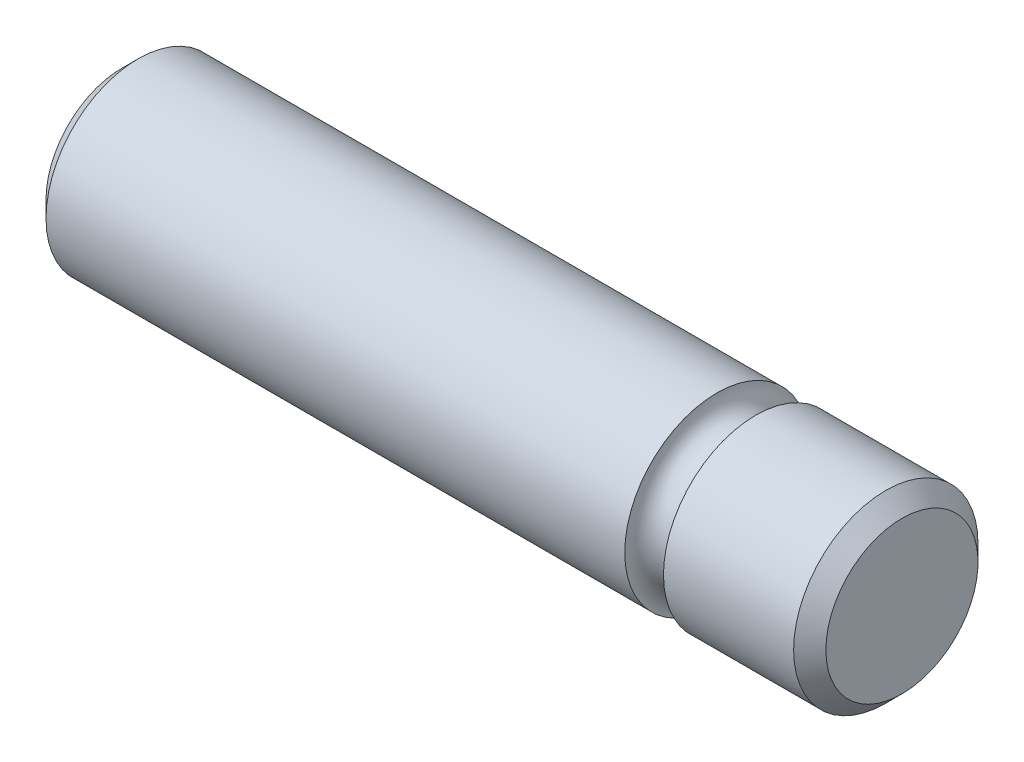
ISO-10303-21;
HEADER;
FILE_DESCRIPTION(('STEP AP214'),'2;1');
FILE_NAME('part.step','',(''),(''),'','','');
FILE_SCHEMA(('AUTOMOTIVE_DESIGN { 1 0 10303 214 1 1 1 1 }'));
ENDSEC;
DATA;
#1=APPLICATION_CONTEXT('core data for automotive mechanical design processes');
#2=APPLICATION_PROTOCOL_DEFINITION('international standard','automotive_design',2000,#1);
#3=PRODUCT_CONTEXT('',#1,'mechanical');
#4=PRODUCT('Part','Part','',(#3));
#5=PRODUCT_RELATED_PRODUCT_CATEGORY('part','',(#4));
#6=PRODUCT_DEFINITION_FORMATION('','',#4);
#7=PRODUCT_DEFINITION_CONTEXT('part definition',#1,'design');
#8=PRODUCT_DEFINITION('design','',#6,#7);
#9=PRODUCT_DEFINITION_SHAPE('','',#8);
#10=(LENGTH_UNIT() NAMED_UNIT(*) SI_UNIT(.MILLI.,.METRE.));
#11=(NAMED_UNIT(*) PLANE_ANGLE_UNIT() SI_UNIT($,.RADIAN.));
#12=(NAMED_UNIT(*) SI_UNIT($,.STERADIAN.) SOLID_ANGLE_UNIT());
#13=UNCERTAINTY_MEASURE_WITH_UNIT(LENGTH_MEASURE(1.E-05),#10,'distance_accuracy_value','');
#14=(GEOMETRIC_REPRESENTATION_CONTEXT(3) GLOBAL_UNCERTAINTY_ASSIGNED_CONTEXT((#13)) GLOBAL_UNIT_ASSIGNED_CONTEXT((#10,
#11,#12)) REPRESENTATION_CONTEXT('',''));
#15=CARTESIAN_POINT('',(0.,0.,0.));
#16=DIRECTION('',(0.,0.,1.));
#17=DIRECTION('',(1.,0.,0.));
#18=AXIS2_PLACEMENT_3D('',#15,#16,#17);
#19=CARTESIAN_POINT('',(5.29592791208791,0.,0.));
#20=DIRECTION('',(-1.,0.,0.));
#21=DIRECTION('',(0.,0.,1.));
#22=AXIS2_PLACEMENT_3D('',#19,#20,#21);
#23=TOROIDAL_SURFACE('',#22,2.17172791208791,0.457227912087912);
#24=CARTESIAN_POINT('',(5.75312791208791,0.,0.));
#25=DIRECTION('',(-1.,0.,0.));
#26=DIRECTION('',(0.,0.,1.));
#27=AXIS2_PLACEMENT_3D('',#24,#25,#26);
#28=CIRCLE('',#27,2.17678);
#29=CARTESIAN_POINT('',(5.75312791208791,0.,2.17678));
#30=VERTEX_POINT('',#29);
#31=EDGE_CURVE('E28',#30,#30,#28,.T.);
#32=ORIENTED_EDGE('',*,*,#31,.T.);
#33=EDGE_LOOP('',(#32));
#34=FACE_BOUND('',#33,.T.);
#35=CARTESIAN_POINT('',(4.83872791208791,0.,0.));
#36=DIRECTION('',(-1.,0.,0.));
#37=DIRECTION('',(0.,0.,1.));
#38=AXIS2_PLACEMENT_3D('',#35,#36,#37);
#39=CIRCLE('',#38,2.17678);
#40=CARTESIAN_POINT('',(4.83872791208791,0.,2.17678));
#41=VERTEX_POINT('',#40);
#42=EDGE_CURVE('E23',#41,#41,#39,.T.);
#43=ORIENTED_EDGE('',*,*,#42,.F.);
#44=EDGE_LOOP('',(#43));
#45=FACE_BOUND('',#44,.T.);
#46=ADVANCED_FACE('F15',(#34,#45),#23,.F.);
#47=CARTESIAN_POINT('',(-8.82650000000001,0.,0.));
#48=DIRECTION('',(1.,0.,0.));
#49=DIRECTION('',(0.,0.,-1.));
#50=AXIS2_PLACEMENT_3D('',#47,#48,#49);
#51=CONICAL_SURFACE('',#50,2.17678,0.785398163397462);
#52=CARTESIAN_POINT('',(-8.82650000000001,0.,0.));
#53=DIRECTION('',(-1.,0.,0.));
#54=DIRECTION('',(0.,0.,1.));
#55=AXIS2_PLACEMENT_3D('',#52,#53,#54);
#56=CIRCLE('',#55,2.17678);
#57=CARTESIAN_POINT('',(-8.82650000000001,0.,2.17678));
#58=VERTEX_POINT('',#57);
#59=EDGE_CURVE('E10',#58,#58,#56,.T.);
#60=ORIENTED_EDGE('',*,*,#59,.T.);
#61=EDGE_LOOP('',(#60));
#62=FACE_BOUND('',#61,.T.);
#63=CARTESIAN_POINT('',(-9.2075,0.,0.));
#64=DIRECTION('',(-1.,0.,0.));
#65=DIRECTION('',(0.,0.,1.));
#66=AXIS2_PLACEMENT_3D('',#63,#64,#65);
#67=CIRCLE('',#66,1.79578);
#68=CARTESIAN_POINT('',(-9.2075,0.,1.79578));
#69=VERTEX_POINT('',#68);
#70=EDGE_CURVE('E32',#69,#69,#67,.T.);
#71=ORIENTED_EDGE('',*,*,#70,.F.);
#72=EDGE_LOOP('',(#71));
#73=FACE_BOUND('',#72,.T.);
#74=ADVANCED_FACE('F45',(#62,#73),#51,.T.);
#75=CARTESIAN_POINT('',(-25.416699322286,0.,0.));
#76=DIRECTION('',(-1.,0.,0.));
#77=DIRECTION('',(0.,0.,1.));
#78=AXIS2_PLACEMENT_3D('',#75,#76,#77);
#79=CYLINDRICAL_SURFACE('',#78,2.17678);
#80=ORIENTED_EDGE('',*,*,#59,.F.);
#81=EDGE_LOOP('',(#80));
#82=FACE_BOUND('',#81,.T.);
#83=ORIENTED_EDGE('',*,*,#42,.T.);
#84=EDGE_LOOP('',(#83));
#85=FACE_BOUND('',#84,.T.);
#86=ADVANCED_FACE('F47',(#82,#85),#79,.T.);
#87=CARTESIAN_POINT('',(-25.416699322286,0.,0.));
#88=DIRECTION('',(-1.,0.,0.));
#89=DIRECTION('',(0.,0.,1.));
#90=AXIS2_PLACEMENT_3D('',#87,#88,#89);
#91=CYLINDRICAL_SURFACE('',#90,2.17678);
#92=ORIENTED_EDGE('',*,*,#31,.F.);
#93=EDGE_LOOP('',(#92));
#94=FACE_BOUND('',#93,.T.);
#95=CARTESIAN_POINT('',(8.82650000000001,0.,0.));
#96=DIRECTION('',(-1.,0.,0.));
#97=DIRECTION('',(0.,0.,1.));
#98=AXIS2_PLACEMENT_3D('',#95,#96,#97);
#99=CIRCLE('',#98,2.17678);
#100=CARTESIAN_POINT('',(8.82650000000001,0.,2.17678));
#101=VERTEX_POINT('',#100);
#102=EDGE_CURVE('E34',#101,#101,#99,.T.);
#103=ORIENTED_EDGE('',*,*,#102,.T.);
#104=EDGE_LOOP('',(#103));
#105=FACE_BOUND('',#104,.T.);
#106=ADVANCED_FACE('F54',(#94,#105),#91,.T.);
#107=CARTESIAN_POINT('',(9.2075,0.,0.));
#108=DIRECTION('',(-1.,0.,0.));
#109=DIRECTION('',(0.,0.,1.));
#110=AXIS2_PLACEMENT_3D('',#107,#108,#109);
#111=CONICAL_SURFACE('',#110,1.79578,0.785398163397457);
#112=ORIENTED_EDGE('',*,*,#102,.F.);
#113=EDGE_LOOP('',(#112));
#114=FACE_BOUND('',#113,.T.);
#115=CARTESIAN_POINT('',(9.2075,0.,0.));
#116=DIRECTION('',(-1.,0.,0.));
#117=DIRECTION('',(0.,0.,1.));
#118=AXIS2_PLACEMENT_3D('',#115,#116,#117);
#119=CIRCLE('',#118,1.79578);
#120=CARTESIAN_POINT('',(9.2075,0.,1.79578));
#121=VERTEX_POINT('',#120);
#122=EDGE_CURVE('E19',#121,#121,#119,.T.);
#123=ORIENTED_EDGE('',*,*,#122,.T.);
#124=EDGE_LOOP('',(#123));
#125=FACE_BOUND('',#124,.T.);
#126=ADVANCED_FACE('F62',(#114,#125),#111,.T.);
#127=CARTESIAN_POINT('',(9.2075,1.79577999999997,0.));
#128=DIRECTION('',(-1.,0.,0.));
#129=DIRECTION('',(0.,0.,1.));
#130=AXIS2_PLACEMENT_3D('',#127,#128,#129);
#131=PLANE('',#130);
#132=ORIENTED_EDGE('',*,*,#122,.F.);
#133=EDGE_LOOP('',(#132));
#134=FACE_BOUND('',#133,.T.);
#135=ADVANCED_FACE('F65',(#134),#131,.F.);
#136=CARTESIAN_POINT('',(-9.2075,0.,0.));
#137=DIRECTION('',(1.,0.,0.));
#138=DIRECTION('',(0.,0.,-1.));
#139=AXIS2_PLACEMENT_3D('',#136,#137,#138);
#140=PLANE('',#139);
#141=ORIENTED_EDGE('',*,*,#70,.T.);
#142=EDGE_LOOP('',(#141));
#143=FACE_BOUND('',#142,.T.);
#144=ADVANCED_FACE('F17',(#143),#140,.F.);
#145=CLOSED_SHELL('',(#46,#74,#86,#106,#126,#135,#144));
#146=MANIFOLD_SOLID_BREP('B1',#145);
#147=ADVANCED_BREP_SHAPE_REPRESENTATION('',(#18,#146),#14);
#148=SHAPE_DEFINITION_REPRESENTATION(#9,#147);
ENDSEC;
END-ISO-10303-21;
